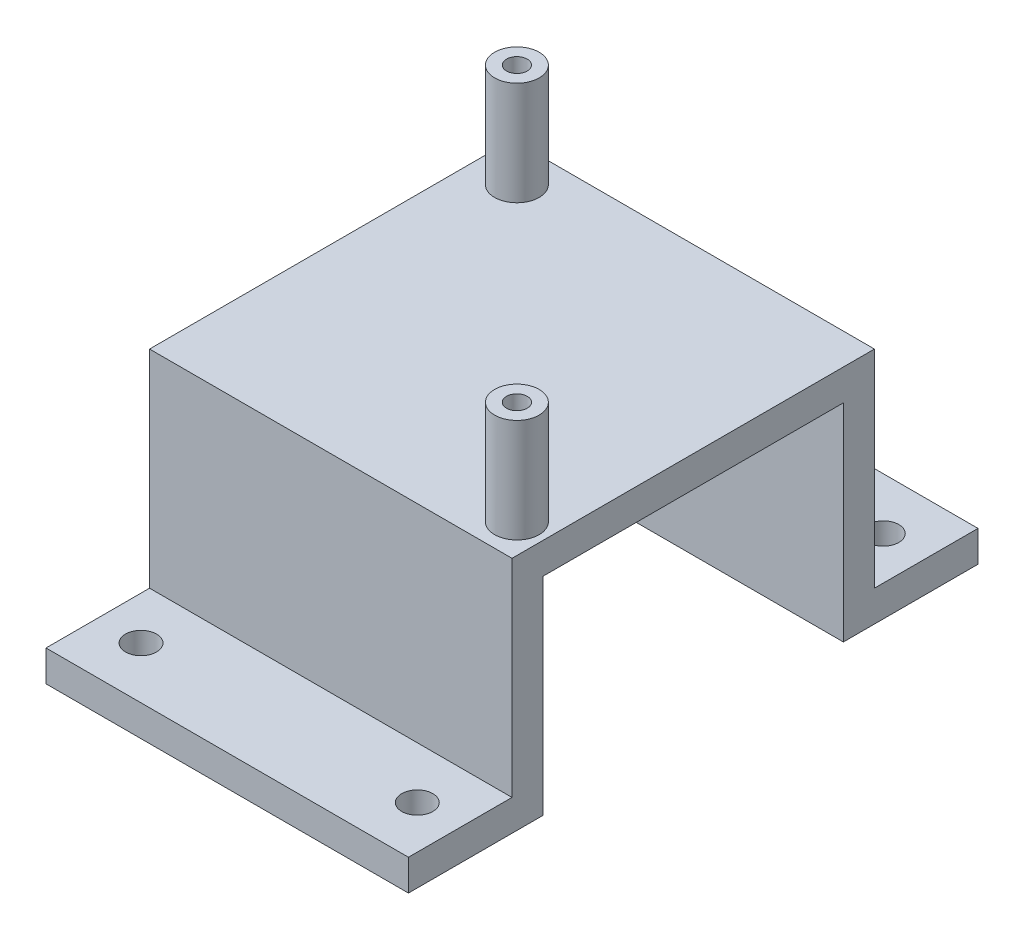
ISO-10303-21;
HEADER;
FILE_DESCRIPTION(('STEP AP214'),'2;1');
FILE_NAME('part.step','',(''),(''),'','','');
FILE_SCHEMA(('AUTOMOTIVE_DESIGN { 1 0 10303 214 1 1 1 1 }'));
ENDSEC;
DATA;
#1=APPLICATION_CONTEXT('core data for automotive mechanical design processes');
#2=APPLICATION_PROTOCOL_DEFINITION('international standard','automotive_design',2000,#1);
#3=PRODUCT_CONTEXT('',#1,'mechanical');
#4=PRODUCT('Part','Part','',(#3));
#5=PRODUCT_RELATED_PRODUCT_CATEGORY('part','',(#4));
#6=PRODUCT_DEFINITION_FORMATION('','',#4);
#7=PRODUCT_DEFINITION_CONTEXT('part definition',#1,'design');
#8=PRODUCT_DEFINITION('design','',#6,#7);
#9=PRODUCT_DEFINITION_SHAPE('','',#8);
#10=(LENGTH_UNIT() NAMED_UNIT(*) SI_UNIT(.MILLI.,.METRE.));
#11=(NAMED_UNIT(*) PLANE_ANGLE_UNIT() SI_UNIT($,.RADIAN.));
#12=(NAMED_UNIT(*) SI_UNIT($,.STERADIAN.) SOLID_ANGLE_UNIT());
#13=UNCERTAINTY_MEASURE_WITH_UNIT(LENGTH_MEASURE(1.E-05),#10,'distance_accuracy_value','');
#14=(GEOMETRIC_REPRESENTATION_CONTEXT(3) GLOBAL_UNCERTAINTY_ASSIGNED_CONTEXT((#13)) GLOBAL_UNIT_ASSIGNED_CONTEXT((#10,
#11,#12)) REPRESENTATION_CONTEXT('',''));
#15=CARTESIAN_POINT('',(0.,0.,0.));
#16=DIRECTION('',(0.,0.,1.));
#17=DIRECTION('',(1.,0.,0.));
#18=AXIS2_PLACEMENT_3D('',#15,#16,#17);
#19=CARTESIAN_POINT('',(-17.5,3.,-17.5));
#20=DIRECTION('',(0.,0.,1.));
#21=DIRECTION('',(1.,0.,0.));
#22=AXIS2_PLACEMENT_3D('',#19,#20,#21);
#23=PLANE('',#22);
#24=DIRECTION('',(1.,0.,0.));
#25=VECTOR('',#24,1.);
#26=CARTESIAN_POINT('',(-17.5,-17.,-17.5));
#27=LINE('',#26,#25);
#28=CARTESIAN_POINT('',(-17.5,-17.,-17.5));
#29=VERTEX_POINT('',#28);
#30=CARTESIAN_POINT('',(17.5,-17.,-17.5));
#31=VERTEX_POINT('',#30);
#32=EDGE_CURVE('E67',#29,#31,#27,.T.);
#33=ORIENTED_EDGE('',*,*,#32,.F.);
#34=DIRECTION('',(0.,-1.,0.));
#35=VECTOR('',#34,1.);
#36=CARTESIAN_POINT('',(-17.5,3.,-17.5));
#37=LINE('',#36,#35);
#38=CARTESIAN_POINT('',(-17.5,3.,-17.5));
#39=VERTEX_POINT('',#38);
#40=EDGE_CURVE('E305',#39,#29,#37,.T.);
#41=ORIENTED_EDGE('',*,*,#40,.F.);
#42=DIRECTION('',(-1.,0.,0.));
#43=VECTOR('',#42,1.);
#44=CARTESIAN_POINT('',(-17.5,3.,-17.5));
#45=LINE('',#44,#43);
#46=CARTESIAN_POINT('',(17.5,3.,-17.5));
#47=VERTEX_POINT('',#46);
#48=EDGE_CURVE('E282',#47,#39,#45,.T.);
#49=ORIENTED_EDGE('',*,*,#48,.F.);
#50=DIRECTION('',(0.,-1.,0.));
#51=VECTOR('',#50,1.);
#52=CARTESIAN_POINT('',(17.5,3.,-17.5));
#53=LINE('',#52,#51);
#54=EDGE_CURVE('E308',#47,#31,#53,.T.);
#55=ORIENTED_EDGE('',*,*,#54,.T.);
#56=EDGE_LOOP('',(#33,#41,#49,#55));
#57=FACE_BOUND('',#56,.T.);
#58=ADVANCED_FACE('F43',(#57),#23,.F.);
#59=CARTESIAN_POINT('',(0.,0.,0.));
#60=DIRECTION('',(0.,-1.,0.));
#61=DIRECTION('',(0.,0.,-1.));
#62=AXIS2_PLACEMENT_3D('',#59,#60,#61);
#63=PLANE('',#62);
#64=DIRECTION('',(0.,0.,1.));
#65=VECTOR('',#64,1.);
#66=CARTESIAN_POINT('',(-17.5,0.,17.5));
#67=LINE('',#66,#65);
#68=CARTESIAN_POINT('',(-17.5,0.,-14.5));
#69=VERTEX_POINT('',#68);
#70=CARTESIAN_POINT('',(-17.5,0.,14.5));
#71=VERTEX_POINT('',#70);
#72=EDGE_CURVE('E283',#69,#71,#67,.T.);
#73=ORIENTED_EDGE('',*,*,#72,.F.);
#74=DIRECTION('',(-1.,0.,0.));
#75=VECTOR('',#74,1.);
#76=CARTESIAN_POINT('',(17.5,0.,-14.5));
#77=LINE('',#76,#75);
#78=CARTESIAN_POINT('',(17.5,0.,-14.5));
#79=VERTEX_POINT('',#78);
#80=EDGE_CURVE('E228',#79,#69,#77,.T.);
#81=ORIENTED_EDGE('',*,*,#80,.F.);
#82=DIRECTION('',(0.,0.,-1.));
#83=VECTOR('',#82,1.);
#84=CARTESIAN_POINT('',(17.5,0.,17.5));
#85=LINE('',#84,#83);
#86=CARTESIAN_POINT('',(17.5,0.,14.5));
#87=VERTEX_POINT('',#86);
#88=EDGE_CURVE('E277',#87,#79,#85,.T.);
#89=ORIENTED_EDGE('',*,*,#88,.F.);
#90=DIRECTION('',(1.,0.,0.));
#91=VECTOR('',#90,1.);
#92=CARTESIAN_POINT('',(-17.5,0.,14.5));
#93=LINE('',#92,#91);
#94=EDGE_CURVE('E147',#71,#87,#93,.T.);
#95=ORIENTED_EDGE('',*,*,#94,.F.);
#96=EDGE_LOOP('',(#73,#81,#89,#95));
#97=FACE_BOUND('',#96,.T.);
#98=ADVANCED_FACE('F357',(#97),#63,.T.);
#99=CARTESIAN_POINT('',(17.5,3.,17.5));
#100=DIRECTION('',(-1.,0.,0.));
#101=DIRECTION('',(0.,0.,1.));
#102=AXIS2_PLACEMENT_3D('',#99,#100,#101);
#103=PLANE('',#102);
#104=DIRECTION('',(0.,-1.,0.));
#105=VECTOR('',#104,1.);
#106=CARTESIAN_POINT('',(17.5,3.,17.5));
#107=LINE('',#106,#105);
#108=CARTESIAN_POINT('',(17.5,3.,17.5));
#109=VERTEX_POINT('',#108);
#110=CARTESIAN_POINT('',(17.5,-17.,17.5));
#111=VERTEX_POINT('',#110);
#112=EDGE_CURVE('E292',#109,#111,#107,.T.);
#113=ORIENTED_EDGE('',*,*,#112,.T.);
#114=DIRECTION('',(0.,0.,-1.));
#115=VECTOR('',#114,1.);
#116=CARTESIAN_POINT('',(17.5,-17.,27.5));
#117=LINE('',#116,#115);
#118=CARTESIAN_POINT('',(17.5,-17.,27.5));
#119=VERTEX_POINT('',#118);
#120=EDGE_CURVE('E59',#119,#111,#117,.T.);
#121=ORIENTED_EDGE('',*,*,#120,.F.);
#122=DIRECTION('',(0.,-1.,0.));
#123=VECTOR('',#122,1.);
#124=CARTESIAN_POINT('',(17.5,-20.,27.5));
#125=LINE('',#124,#123);
#126=CARTESIAN_POINT('',(17.5,-20.,27.5));
#127=VERTEX_POINT('',#126);
#128=EDGE_CURVE('E163',#119,#127,#125,.T.);
#129=ORIENTED_EDGE('',*,*,#128,.T.);
#130=DIRECTION('',(0.,0.,1.));
#131=VECTOR('',#130,1.);
#132=CARTESIAN_POINT('',(17.5,-20.,17.5));
#133=LINE('',#132,#131);
#134=CARTESIAN_POINT('',(17.5,-20.,14.5));
#135=VERTEX_POINT('',#134);
#136=EDGE_CURVE('E161',#135,#127,#133,.T.);
#137=ORIENTED_EDGE('',*,*,#136,.F.);
#138=DIRECTION('',(0.,1.,0.));
#139=VECTOR('',#138,1.);
#140=CARTESIAN_POINT('',(17.5,-20.,14.5));
#141=LINE('',#140,#139);
#142=EDGE_CURVE('E244',#135,#87,#141,.T.);
#143=ORIENTED_EDGE('',*,*,#142,.T.);
#144=ORIENTED_EDGE('',*,*,#88,.T.);
#145=DIRECTION('',(0.,1.,0.));
#146=VECTOR('',#145,1.);
#147=CARTESIAN_POINT('',(17.5,-20.,-14.5));
#148=LINE('',#147,#146);
#149=CARTESIAN_POINT('',(17.5,-20.,-14.5));
#150=VERTEX_POINT('',#149);
#151=EDGE_CURVE('E220',#150,#79,#148,.T.);
#152=ORIENTED_EDGE('',*,*,#151,.F.);
#153=DIRECTION('',(0.,0.,1.));
#154=VECTOR('',#153,1.);
#155=CARTESIAN_POINT('',(17.5,-20.,-17.5));
#156=LINE('',#155,#154);
#157=CARTESIAN_POINT('',(17.5,-20.,-27.5));
#158=VERTEX_POINT('',#157);
#159=EDGE_CURVE('E231',#158,#150,#156,.T.);
#160=ORIENTED_EDGE('',*,*,#159,.F.);
#161=DIRECTION('',(0.,-1.,0.));
#162=VECTOR('',#161,1.);
#163=CARTESIAN_POINT('',(17.5,-20.,-27.5));
#164=LINE('',#163,#162);
#165=CARTESIAN_POINT('',(17.5,-17.,-27.5));
#166=VERTEX_POINT('',#165);
#167=EDGE_CURVE('E202',#166,#158,#164,.T.);
#168=ORIENTED_EDGE('',*,*,#167,.F.);
#169=DIRECTION('',(0.,0.,1.));
#170=VECTOR('',#169,1.);
#171=CARTESIAN_POINT('',(17.5,-17.,-27.5));
#172=LINE('',#171,#170);
#173=EDGE_CURVE('E210',#166,#31,#172,.T.);
#174=ORIENTED_EDGE('',*,*,#173,.T.);
#175=ORIENTED_EDGE('',*,*,#54,.F.);
#176=DIRECTION('',(0.,0.,-1.));
#177=VECTOR('',#176,1.);
#178=CARTESIAN_POINT('',(17.5,3.,17.5));
#179=LINE('',#178,#177);
#180=EDGE_CURVE('E278',#109,#47,#179,.T.);
#181=ORIENTED_EDGE('',*,*,#180,.F.);
#182=EDGE_LOOP('',(#113,#121,#129,#137,#143,#144,#152,#160,#168,#174,#175,#181));
#183=FACE_BOUND('',#182,.T.);
#184=ADVANCED_FACE('F45',(#183),#103,.F.);
#185=CARTESIAN_POINT('',(-17.5,3.,17.5));
#186=DIRECTION('',(1.,0.,0.));
#187=DIRECTION('',(0.,0.,-1.));
#188=AXIS2_PLACEMENT_3D('',#185,#186,#187);
#189=PLANE('',#188);
#190=ORIENTED_EDGE('',*,*,#40,.T.);
#191=DIRECTION('',(0.,0.,1.));
#192=VECTOR('',#191,1.);
#193=CARTESIAN_POINT('',(-17.5,-17.,-27.5));
#194=LINE('',#193,#192);
#195=CARTESIAN_POINT('',(-17.5,-17.,-27.5));
#196=VERTEX_POINT('',#195);
#197=EDGE_CURVE('E216',#196,#29,#194,.T.);
#198=ORIENTED_EDGE('',*,*,#197,.F.);
#199=DIRECTION('',(0.,1.,0.));
#200=VECTOR('',#199,1.);
#201=CARTESIAN_POINT('',(-17.5,-20.,-27.5));
#202=LINE('',#201,#200);
#203=CARTESIAN_POINT('',(-17.5,-20.,-27.5));
#204=VERTEX_POINT('',#203);
#205=EDGE_CURVE('E195',#204,#196,#202,.T.);
#206=ORIENTED_EDGE('',*,*,#205,.F.);
#207=DIRECTION('',(0.,0.,-1.));
#208=VECTOR('',#207,1.);
#209=CARTESIAN_POINT('',(-17.5,-20.,-17.5));
#210=LINE('',#209,#208);
#211=CARTESIAN_POINT('',(-17.5,-20.,-14.5));
#212=VERTEX_POINT('',#211);
#213=EDGE_CURVE('E227',#212,#204,#210,.T.);
#214=ORIENTED_EDGE('',*,*,#213,.F.);
#215=DIRECTION('',(0.,1.,0.));
#216=VECTOR('',#215,1.);
#217=CARTESIAN_POINT('',(-17.5,-20.,-14.5));
#218=LINE('',#217,#216);
#219=EDGE_CURVE('E223',#212,#69,#218,.T.);
#220=ORIENTED_EDGE('',*,*,#219,.T.);
#221=ORIENTED_EDGE('',*,*,#72,.T.);
#222=DIRECTION('',(0.,1.,0.));
#223=VECTOR('',#222,1.);
#224=CARTESIAN_POINT('',(-17.5,-20.,14.5));
#225=LINE('',#224,#223);
#226=CARTESIAN_POINT('',(-17.5,-20.,14.5));
#227=VERTEX_POINT('',#226);
#228=EDGE_CURVE('E142',#227,#71,#225,.T.);
#229=ORIENTED_EDGE('',*,*,#228,.F.);
#230=DIRECTION('',(0.,0.,-1.));
#231=VECTOR('',#230,1.);
#232=CARTESIAN_POINT('',(-17.5,-20.,17.5));
#233=LINE('',#232,#231);
#234=CARTESIAN_POINT('',(-17.5,-20.,27.5));
#235=VERTEX_POINT('',#234);
#236=EDGE_CURVE('E136',#235,#227,#233,.T.);
#237=ORIENTED_EDGE('',*,*,#236,.F.);
#238=DIRECTION('',(0.,1.,0.));
#239=VECTOR('',#238,1.);
#240=CARTESIAN_POINT('',(-17.5,-20.,27.5));
#241=LINE('',#240,#239);
#242=CARTESIAN_POINT('',(-17.5,-17.,27.5));
#243=VERTEX_POINT('',#242);
#244=EDGE_CURVE('E139',#235,#243,#241,.T.);
#245=ORIENTED_EDGE('',*,*,#244,.T.);
#246=DIRECTION('',(0.,0.,-1.));
#247=VECTOR('',#246,1.);
#248=CARTESIAN_POINT('',(-17.5,-17.,27.5));
#249=LINE('',#248,#247);
#250=CARTESIAN_POINT('',(-17.5,-17.,17.5));
#251=VERTEX_POINT('',#250);
#252=EDGE_CURVE('E171',#243,#251,#249,.T.);
#253=ORIENTED_EDGE('',*,*,#252,.T.);
#254=DIRECTION('',(0.,-1.,0.));
#255=VECTOR('',#254,1.);
#256=CARTESIAN_POINT('',(-17.5,3.,17.5));
#257=LINE('',#256,#255);
#258=CARTESIAN_POINT('',(-17.5,3.,17.5));
#259=VERTEX_POINT('',#258);
#260=EDGE_CURVE('E301',#259,#251,#257,.T.);
#261=ORIENTED_EDGE('',*,*,#260,.F.);
#262=DIRECTION('',(0.,0.,1.));
#263=VECTOR('',#262,1.);
#264=CARTESIAN_POINT('',(-17.5,3.,17.5));
#265=LINE('',#264,#263);
#266=EDGE_CURVE('E286',#39,#259,#265,.T.);
#267=ORIENTED_EDGE('',*,*,#266,.F.);
#268=EDGE_LOOP('',(#190,#198,#206,#214,#220,#221,#229,#237,#245,#253,#261,#267));
#269=FACE_BOUND('',#268,.T.);
#270=ADVANCED_FACE('F138',(#269),#189,.F.);
#271=CARTESIAN_POINT('',(-17.5,3.,17.5));
#272=DIRECTION('',(0.,0.,-1.));
#273=DIRECTION('',(-1.,0.,0.));
#274=AXIS2_PLACEMENT_3D('',#271,#272,#273);
#275=PLANE('',#274);
#276=ORIENTED_EDGE('',*,*,#260,.T.);
#277=DIRECTION('',(1.,0.,0.));
#278=VECTOR('',#277,1.);
#279=CARTESIAN_POINT('',(-17.5,-17.,17.5));
#280=LINE('',#279,#278);
#281=EDGE_CURVE('E157',#251,#111,#280,.T.);
#282=ORIENTED_EDGE('',*,*,#281,.T.);
#283=ORIENTED_EDGE('',*,*,#112,.F.);
#284=DIRECTION('',(1.,0.,0.));
#285=VECTOR('',#284,1.);
#286=CARTESIAN_POINT('',(-17.5,3.,17.5));
#287=LINE('',#286,#285);
#288=EDGE_CURVE('E289',#259,#109,#287,.T.);
#289=ORIENTED_EDGE('',*,*,#288,.F.);
#290=EDGE_LOOP('',(#276,#282,#283,#289));
#291=FACE_BOUND('',#290,.T.);
#292=ADVANCED_FACE('F320',(#291),#275,.F.);
#293=CARTESIAN_POINT('',(0.,3.,0.));
#294=DIRECTION('',(0.,-1.,0.));
#295=DIRECTION('',(0.,0.,-1.));
#296=AXIS2_PLACEMENT_3D('',#293,#294,#295);
#297=PLANE('',#296);
#298=CARTESIAN_POINT('',(14.6873098288263,3.,14.2151940368629));
#299=DIRECTION('',(0.,-1.,0.));
#300=DIRECTION('',(0.,0.,-1.));
#301=AXIS2_PLACEMENT_3D('',#298,#299,#300);
#302=CIRCLE('',#301,2.15);
#303=CARTESIAN_POINT('',(14.6873098288263,3.,12.0651940368629));
#304=VERTEX_POINT('',#303);
#305=EDGE_CURVE('E11',#304,#304,#302,.F.);
#306=ORIENTED_EDGE('',*,*,#305,.F.);
#307=EDGE_LOOP('',(#306));
#308=FACE_BOUND('',#307,.T.);
#309=CARTESIAN_POINT('',(-13.5126901711737,3.,-13.9848059631371));
#310=DIRECTION('',(0.,-1.,0.));
#311=DIRECTION('',(0.,0.,-1.));
#312=AXIS2_PLACEMENT_3D('',#309,#310,#311);
#313=CIRCLE('',#312,2.15);
#314=CARTESIAN_POINT('',(-13.5126901711737,3.,-16.1348059631371));
#315=VERTEX_POINT('',#314);
#316=EDGE_CURVE('E52',#315,#315,#313,.F.);
#317=ORIENTED_EDGE('',*,*,#316,.F.);
#318=EDGE_LOOP('',(#317));
#319=FACE_BOUND('',#318,.T.);
#320=ORIENTED_EDGE('',*,*,#180,.T.);
#321=ORIENTED_EDGE('',*,*,#48,.T.);
#322=ORIENTED_EDGE('',*,*,#266,.T.);
#323=ORIENTED_EDGE('',*,*,#288,.T.);
#324=EDGE_LOOP('',(#320,#321,#322,#323));
#325=FACE_BOUND('',#324,.T.);
#326=ADVANCED_FACE('F316',(#308,#319,#325),#297,.F.);
#327=CARTESIAN_POINT('',(-13.5126901711737,13.,-13.9848059631371));
#328=DIRECTION('',(0.,1.,0.));
#329=DIRECTION('',(0.,0.,1.));
#330=AXIS2_PLACEMENT_3D('',#327,#328,#329);
#331=PLANE('',#330);
#332=CARTESIAN_POINT('',(-13.5126901711737,13.,-13.9848059631371));
#333=DIRECTION('',(0.,1.,0.));
#334=DIRECTION('',(0.,0.,1.));
#335=AXIS2_PLACEMENT_3D('',#332,#333,#334);
#336=CIRCLE('',#335,2.15);
#337=CARTESIAN_POINT('',(-13.5126901711737,13.,-11.8348059631371));
#338=VERTEX_POINT('',#337);
#339=EDGE_CURVE('E270',#338,#338,#336,.T.);
#340=ORIENTED_EDGE('',*,*,#339,.T.);
#341=EDGE_LOOP('',(#340));
#342=FACE_BOUND('',#341,.T.);
#343=CARTESIAN_POINT('',(-13.5126901711737,13.,-13.9848059631371));
#344=DIRECTION('',(0.,1.,0.));
#345=DIRECTION('',(0.,0.,1.));
#346=AXIS2_PLACEMENT_3D('',#343,#344,#345);
#347=CIRCLE('',#346,1.);
#348=CARTESIAN_POINT('',(-13.5126901711737,13.,-12.9848059631371));
#349=VERTEX_POINT('',#348);
#350=EDGE_CURVE('E266',#349,#349,#347,.T.);
#351=ORIENTED_EDGE('',*,*,#350,.F.);
#352=EDGE_LOOP('',(#351));
#353=FACE_BOUND('',#352,.T.);
#354=ADVANCED_FACE('F319',(#342,#353),#331,.T.);
#355=CARTESIAN_POINT('',(-13.5126901711737,13.,-13.9848059631371));
#356=DIRECTION('',(0.,-1.,0.));
#357=DIRECTION('',(0.,0.,-1.));
#358=AXIS2_PLACEMENT_3D('',#355,#356,#357);
#359=CYLINDRICAL_SURFACE('',#358,2.15);
#360=ORIENTED_EDGE('',*,*,#339,.F.);
#361=EDGE_LOOP('',(#360));
#362=FACE_BOUND('',#361,.T.);
#363=ORIENTED_EDGE('',*,*,#316,.T.);
#364=EDGE_LOOP('',(#363));
#365=FACE_BOUND('',#364,.T.);
#366=ADVANCED_FACE('F314',(#362,#365),#359,.T.);
#367=CARTESIAN_POINT('',(-13.5126901711737,13.,-13.9848059631371));
#368=DIRECTION('',(0.,-1.,0.));
#369=DIRECTION('',(0.,0.,-1.));
#370=AXIS2_PLACEMENT_3D('',#367,#368,#369);
#371=CYLINDRICAL_SURFACE('',#370,1.);
#372=ORIENTED_EDGE('',*,*,#350,.T.);
#373=EDGE_LOOP('',(#372));
#374=FACE_BOUND('',#373,.T.);
#375=CARTESIAN_POINT('',(-13.5126901711737,3.,-13.9848059631371));
#376=DIRECTION('',(0.,1.,0.));
#377=DIRECTION('',(0.,0.,1.));
#378=AXIS2_PLACEMENT_3D('',#375,#376,#377);
#379=CIRCLE('',#378,1.);
#380=CARTESIAN_POINT('',(-13.5126901711737,3.,-12.9848059631371));
#381=VERTEX_POINT('',#380);
#382=EDGE_CURVE('E262',#381,#381,#379,.T.);
#383=ORIENTED_EDGE('',*,*,#382,.F.);
#384=EDGE_LOOP('',(#383));
#385=FACE_BOUND('',#384,.T.);
#386=ADVANCED_FACE('F372',(#374,#385),#371,.F.);
#387=ORIENTED_EDGE('',*,*,#382,.T.);
#388=EDGE_LOOP('',(#387));
#389=FACE_BOUND('',#388,.T.);
#390=ADVANCED_FACE('F324',(#389),#297,.F.);
#391=CARTESIAN_POINT('',(14.6873098288263,13.,14.2151940368629));
#392=DIRECTION('',(0.,1.,0.));
#393=DIRECTION('',(0.,0.,1.));
#394=AXIS2_PLACEMENT_3D('',#391,#392,#393);
#395=PLANE('',#394);
#396=CARTESIAN_POINT('',(14.6873098288263,13.,14.2151940368629));
#397=DIRECTION('',(0.,1.,0.));
#398=DIRECTION('',(0.,0.,1.));
#399=AXIS2_PLACEMENT_3D('',#396,#397,#398);
#400=CIRCLE('',#399,2.15);
#401=CARTESIAN_POINT('',(14.6873098288263,13.,16.3651940368629));
#402=VERTEX_POINT('',#401);
#403=EDGE_CURVE('E253',#402,#402,#400,.T.);
#404=ORIENTED_EDGE('',*,*,#403,.T.);
#405=EDGE_LOOP('',(#404));
#406=FACE_BOUND('',#405,.T.);
#407=CARTESIAN_POINT('',(14.6873098288263,13.,14.2151940368629));
#408=DIRECTION('',(0.,1.,0.));
#409=DIRECTION('',(0.,0.,1.));
#410=AXIS2_PLACEMENT_3D('',#407,#408,#409);
#411=CIRCLE('',#410,1.);
#412=CARTESIAN_POINT('',(14.6873098288263,13.,15.2151940368629));
#413=VERTEX_POINT('',#412);
#414=EDGE_CURVE('E257',#413,#413,#411,.T.);
#415=ORIENTED_EDGE('',*,*,#414,.F.);
#416=EDGE_LOOP('',(#415));
#417=FACE_BOUND('',#416,.T.);
#418=ADVANCED_FACE('F385',(#406,#417),#395,.T.);
#419=CARTESIAN_POINT('',(14.6873098288263,13.,14.2151940368629));
#420=DIRECTION('',(0.,-1.,0.));
#421=DIRECTION('',(0.,0.,-1.));
#422=AXIS2_PLACEMENT_3D('',#419,#420,#421);
#423=CYLINDRICAL_SURFACE('',#422,2.15);
#424=ORIENTED_EDGE('',*,*,#403,.F.);
#425=EDGE_LOOP('',(#424));
#426=FACE_BOUND('',#425,.T.);
#427=ORIENTED_EDGE('',*,*,#305,.T.);
#428=EDGE_LOOP('',(#427));
#429=FACE_BOUND('',#428,.T.);
#430=ADVANCED_FACE('F383',(#426,#429),#423,.T.);
#431=CARTESIAN_POINT('',(14.6873098288263,13.,14.2151940368629));
#432=DIRECTION('',(0.,-1.,0.));
#433=DIRECTION('',(0.,0.,-1.));
#434=AXIS2_PLACEMENT_3D('',#431,#432,#433);
#435=CYLINDRICAL_SURFACE('',#434,1.);
#436=ORIENTED_EDGE('',*,*,#414,.T.);
#437=EDGE_LOOP('',(#436));
#438=FACE_BOUND('',#437,.T.);
#439=CARTESIAN_POINT('',(14.6873098288263,3.,14.2151940368629));
#440=DIRECTION('',(0.,1.,0.));
#441=DIRECTION('',(0.,0.,1.));
#442=AXIS2_PLACEMENT_3D('',#439,#440,#441);
#443=CIRCLE('',#442,1.);
#444=CARTESIAN_POINT('',(14.6873098288263,3.,15.2151940368629));
#445=VERTEX_POINT('',#444);
#446=EDGE_CURVE('E258',#445,#445,#443,.T.);
#447=ORIENTED_EDGE('',*,*,#446,.F.);
#448=EDGE_LOOP('',(#447));
#449=FACE_BOUND('',#448,.T.);
#450=ADVANCED_FACE('F380',(#438,#449),#435,.F.);
#451=ORIENTED_EDGE('',*,*,#446,.T.);
#452=EDGE_LOOP('',(#451));
#453=FACE_BOUND('',#452,.T.);
#454=ADVANCED_FACE('F323',(#453),#297,.F.);
#455=CARTESIAN_POINT('',(-17.5,-20.,14.5));
#456=DIRECTION('',(0.,0.,1.));
#457=DIRECTION('',(1.,0.,0.));
#458=AXIS2_PLACEMENT_3D('',#455,#456,#457);
#459=PLANE('',#458);
#460=ORIENTED_EDGE('',*,*,#94,.T.);
#461=ORIENTED_EDGE('',*,*,#142,.F.);
#462=DIRECTION('',(1.,0.,0.));
#463=VECTOR('',#462,1.);
#464=CARTESIAN_POINT('',(-17.5,-20.,14.5));
#465=LINE('',#464,#463);
#466=EDGE_CURVE('E146',#227,#135,#465,.T.);
#467=ORIENTED_EDGE('',*,*,#466,.F.);
#468=ORIENTED_EDGE('',*,*,#228,.T.);
#469=EDGE_LOOP('',(#460,#461,#467,#468));
#470=FACE_BOUND('',#469,.T.);
#471=ADVANCED_FACE('F392',(#470),#459,.F.);
#472=CARTESIAN_POINT('',(0.,-20.,0.));
#473=DIRECTION('',(0.,-1.,0.));
#474=DIRECTION('',(0.,0.,-1.));
#475=AXIS2_PLACEMENT_3D('',#472,#473,#474);
#476=PLANE('',#475);
#477=CARTESIAN_POINT('',(-13.3246215865193,-20.,22.5));
#478=DIRECTION('',(0.,-1.,0.));
#479=DIRECTION('',(0.,0.,-1.));
#480=AXIS2_PLACEMENT_3D('',#477,#478,#479);
#481=CIRCLE('',#480,1.5);
#482=CARTESIAN_POINT('',(-13.3246215865193,-20.,21.));
#483=VERTEX_POINT('',#482);
#484=EDGE_CURVE('E174',#483,#483,#481,.F.);
#485=ORIENTED_EDGE('',*,*,#484,.T.);
#486=EDGE_LOOP('',(#485));
#487=FACE_BOUND('',#486,.T.);
#488=CARTESIAN_POINT('',(13.3552529005113,-20.,22.5));
#489=DIRECTION('',(0.,-1.,0.));
#490=DIRECTION('',(0.,0.,-1.));
#491=AXIS2_PLACEMENT_3D('',#488,#489,#490);
#492=CIRCLE('',#491,1.5);
#493=CARTESIAN_POINT('',(13.3552529005113,-20.,21.));
#494=VERTEX_POINT('',#493);
#495=EDGE_CURVE('E689',#494,#494,#492,.F.);
#496=ORIENTED_EDGE('',*,*,#495,.T.);
#497=EDGE_LOOP('',(#496));
#498=FACE_BOUND('',#497,.T.);
#499=ORIENTED_EDGE('',*,*,#236,.T.);
#500=ORIENTED_EDGE('',*,*,#466,.T.);
#501=ORIENTED_EDGE('',*,*,#136,.T.);
#502=DIRECTION('',(-1.,0.,0.));
#503=VECTOR('',#502,1.);
#504=CARTESIAN_POINT('',(-17.5,-20.,27.5));
#505=LINE('',#504,#503);
#506=EDGE_CURVE('E153',#127,#235,#505,.T.);
#507=ORIENTED_EDGE('',*,*,#506,.T.);
#508=EDGE_LOOP('',(#499,#500,#501,#507));
#509=FACE_BOUND('',#508,.T.);
#510=ADVANCED_FACE('F159',(#487,#498,#509),#476,.T.);
#511=CARTESIAN_POINT('',(17.5,-20.,-14.5));
#512=DIRECTION('',(0.,0.,-1.));
#513=DIRECTION('',(-1.,0.,0.));
#514=AXIS2_PLACEMENT_3D('',#511,#512,#513);
#515=PLANE('',#514);
#516=ORIENTED_EDGE('',*,*,#80,.T.);
#517=ORIENTED_EDGE('',*,*,#219,.F.);
#518=DIRECTION('',(-1.,0.,0.));
#519=VECTOR('',#518,1.);
#520=CARTESIAN_POINT('',(17.5,-20.,-14.5));
#521=LINE('',#520,#519);
#522=EDGE_CURVE('E234',#150,#212,#521,.T.);
#523=ORIENTED_EDGE('',*,*,#522,.F.);
#524=ORIENTED_EDGE('',*,*,#151,.T.);
#525=EDGE_LOOP('',(#516,#517,#523,#524));
#526=FACE_BOUND('',#525,.T.);
#527=ADVANCED_FACE('F398',(#526),#515,.F.);
#528=CARTESIAN_POINT('',(0.,-20.,0.));
#529=DIRECTION('',(0.,-1.,0.));
#530=DIRECTION('',(0.,0.,-1.));
#531=AXIS2_PLACEMENT_3D('',#528,#529,#530);
#532=PLANE('',#531);
#533=CARTESIAN_POINT('',(-13.3246215865193,-20.,-22.5));
#534=DIRECTION('',(0.,-1.,0.));
#535=DIRECTION('',(0.,0.,-1.));
#536=AXIS2_PLACEMENT_3D('',#533,#534,#535);
#537=CIRCLE('',#536,1.5);
#538=CARTESIAN_POINT('',(-13.3246215865193,-20.,-24.));
#539=VERTEX_POINT('',#538);
#540=EDGE_CURVE('E191',#539,#539,#537,.T.);
#541=ORIENTED_EDGE('',*,*,#540,.F.);
#542=EDGE_LOOP('',(#541));
#543=FACE_BOUND('',#542,.T.);
#544=CARTESIAN_POINT('',(13.3552529005113,-20.,-22.5));
#545=DIRECTION('',(0.,-1.,0.));
#546=DIRECTION('',(0.,0.,-1.));
#547=AXIS2_PLACEMENT_3D('',#544,#545,#546);
#548=CIRCLE('',#547,1.5);
#549=CARTESIAN_POINT('',(13.3552529005113,-20.,-24.));
#550=VERTEX_POINT('',#549);
#551=EDGE_CURVE('E184',#550,#550,#548,.T.);
#552=ORIENTED_EDGE('',*,*,#551,.F.);
#553=EDGE_LOOP('',(#552));
#554=FACE_BOUND('',#553,.T.);
#555=ORIENTED_EDGE('',*,*,#159,.T.);
#556=ORIENTED_EDGE('',*,*,#522,.T.);
#557=ORIENTED_EDGE('',*,*,#213,.T.);
#558=DIRECTION('',(-1.,0.,0.));
#559=VECTOR('',#558,1.);
#560=CARTESIAN_POINT('',(-17.5,-20.,-27.5));
#561=LINE('',#560,#559);
#562=EDGE_CURVE('E206',#158,#204,#561,.T.);
#563=ORIENTED_EDGE('',*,*,#562,.F.);
#564=EDGE_LOOP('',(#555,#556,#557,#563));
#565=FACE_BOUND('',#564,.T.);
#566=ADVANCED_FACE('F400',(#543,#554,#565),#532,.T.);
#567=CARTESIAN_POINT('',(-17.5,-17.,-27.5));
#568=DIRECTION('',(0.,-1.,0.));
#569=DIRECTION('',(0.,0.,-1.));
#570=AXIS2_PLACEMENT_3D('',#567,#568,#569);
#571=PLANE('',#570);
#572=CARTESIAN_POINT('',(-13.3246215865193,-17.,-22.5));
#573=DIRECTION('',(0.,1.,0.));
#574=DIRECTION('',(-1.,0.,0.));
#575=AXIS2_PLACEMENT_3D('',#572,#573,#574);
#576=CIRCLE('',#575,1.5);
#577=CARTESIAN_POINT('',(-14.8246215865193,-17.,-22.5));
#578=VERTEX_POINT('',#577);
#579=EDGE_CURVE('E180',#578,#578,#576,.T.);
#580=ORIENTED_EDGE('',*,*,#579,.F.);
#581=EDGE_LOOP('',(#580));
#582=FACE_BOUND('',#581,.T.);
#583=CARTESIAN_POINT('',(13.3552529005113,-17.,-22.5));
#584=DIRECTION('',(0.,1.,0.));
#585=DIRECTION('',(-1.,0.,0.));
#586=AXIS2_PLACEMENT_3D('',#583,#584,#585);
#587=CIRCLE('',#586,1.5);
#588=CARTESIAN_POINT('',(11.8552529005113,-17.,-22.5));
#589=VERTEX_POINT('',#588);
#590=EDGE_CURVE('E179',#589,#589,#587,.T.);
#591=ORIENTED_EDGE('',*,*,#590,.F.);
#592=EDGE_LOOP('',(#591));
#593=FACE_BOUND('',#592,.T.);
#594=ORIENTED_EDGE('',*,*,#32,.T.);
#595=ORIENTED_EDGE('',*,*,#173,.F.);
#596=DIRECTION('',(1.,0.,0.));
#597=VECTOR('',#596,1.);
#598=CARTESIAN_POINT('',(-17.5,-17.,-27.5));
#599=LINE('',#598,#597);
#600=EDGE_CURVE('E199',#196,#166,#599,.T.);
#601=ORIENTED_EDGE('',*,*,#600,.F.);
#602=ORIENTED_EDGE('',*,*,#197,.T.);
#603=EDGE_LOOP('',(#594,#595,#601,#602));
#604=FACE_BOUND('',#603,.T.);
#605=ADVANCED_FACE('F333',(#582,#593,#604),#571,.F.);
#606=CARTESIAN_POINT('',(0.,0.,-27.5));
#607=DIRECTION('',(0.,0.,-1.));
#608=DIRECTION('',(-1.,0.,0.));
#609=AXIS2_PLACEMENT_3D('',#606,#607,#608);
#610=PLANE('',#609);
#611=ORIENTED_EDGE('',*,*,#205,.T.);
#612=ORIENTED_EDGE('',*,*,#600,.T.);
#613=ORIENTED_EDGE('',*,*,#167,.T.);
#614=ORIENTED_EDGE('',*,*,#562,.T.);
#615=EDGE_LOOP('',(#611,#612,#613,#614));
#616=FACE_BOUND('',#615,.T.);
#617=ADVANCED_FACE('F409',(#616),#610,.T.);
#618=CARTESIAN_POINT('',(13.3552529005113,-27.,-22.5));
#619=DIRECTION('',(0.,1.,0.));
#620=DIRECTION('',(-1.,0.,0.));
#621=AXIS2_PLACEMENT_3D('',#618,#619,#620);
#622=CYLINDRICAL_SURFACE('',#621,1.5);
#623=ORIENTED_EDGE('',*,*,#551,.T.);
#624=EDGE_LOOP('',(#623));
#625=FACE_BOUND('',#624,.T.);
#626=ORIENTED_EDGE('',*,*,#590,.T.);
#627=EDGE_LOOP('',(#626));
#628=FACE_BOUND('',#627,.T.);
#629=ADVANCED_FACE('F351',(#625,#628),#622,.F.);
#630=CARTESIAN_POINT('',(-13.3246215865193,-27.,-22.5));
#631=DIRECTION('',(0.,1.,0.));
#632=DIRECTION('',(-1.,0.,0.));
#633=AXIS2_PLACEMENT_3D('',#630,#631,#632);
#634=CYLINDRICAL_SURFACE('',#633,1.5);
#635=ORIENTED_EDGE('',*,*,#540,.T.);
#636=EDGE_LOOP('',(#635));
#637=FACE_BOUND('',#636,.T.);
#638=ORIENTED_EDGE('',*,*,#579,.T.);
#639=EDGE_LOOP('',(#638));
#640=FACE_BOUND('',#639,.T.);
#641=ADVANCED_FACE('F342',(#637,#640),#634,.F.);
#642=CARTESIAN_POINT('',(-17.5,-17.,27.5));
#643=DIRECTION('',(0.,1.,0.));
#644=DIRECTION('',(0.,0.,1.));
#645=AXIS2_PLACEMENT_3D('',#642,#643,#644);
#646=PLANE('',#645);
#647=CARTESIAN_POINT('',(-13.3246215865193,-17.,22.5));
#648=DIRECTION('',(0.,-1.,0.));
#649=DIRECTION('',(-1.,0.,0.));
#650=AXIS2_PLACEMENT_3D('',#647,#648,#649);
#651=CIRCLE('',#650,1.5);
#652=CARTESIAN_POINT('',(-14.8246215865193,-17.,22.5));
#653=VERTEX_POINT('',#652);
#654=EDGE_CURVE('E687',#653,#653,#651,.T.);
#655=ORIENTED_EDGE('',*,*,#654,.T.);
#656=EDGE_LOOP('',(#655));
#657=FACE_BOUND('',#656,.T.);
#658=CARTESIAN_POINT('',(13.3552529005113,-17.,22.5));
#659=DIRECTION('',(0.,-1.,0.));
#660=DIRECTION('',(-1.,0.,0.));
#661=AXIS2_PLACEMENT_3D('',#658,#659,#660);
#662=CIRCLE('',#661,1.5);
#663=CARTESIAN_POINT('',(11.8552529005113,-17.,22.5));
#664=VERTEX_POINT('',#663);
#665=EDGE_CURVE('E690',#664,#664,#662,.T.);
#666=ORIENTED_EDGE('',*,*,#665,.T.);
#667=EDGE_LOOP('',(#666));
#668=FACE_BOUND('',#667,.T.);
#669=ORIENTED_EDGE('',*,*,#281,.F.);
#670=ORIENTED_EDGE('',*,*,#252,.F.);
#671=DIRECTION('',(1.,0.,0.));
#672=VECTOR('',#671,1.);
#673=CARTESIAN_POINT('',(-17.5,-17.,27.5));
#674=LINE('',#673,#672);
#675=EDGE_CURVE('E155',#243,#119,#674,.T.);
#676=ORIENTED_EDGE('',*,*,#675,.T.);
#677=ORIENTED_EDGE('',*,*,#120,.T.);
#678=EDGE_LOOP('',(#669,#670,#676,#677));
#679=FACE_BOUND('',#678,.T.);
#680=ADVANCED_FACE('F340',(#657,#668,#679),#646,.T.);
#681=CARTESIAN_POINT('',(0.,0.,27.5));
#682=DIRECTION('',(0.,0.,1.));
#683=DIRECTION('',(-1.,0.,0.));
#684=AXIS2_PLACEMENT_3D('',#681,#682,#683);
#685=PLANE('',#684);
#686=ORIENTED_EDGE('',*,*,#244,.F.);
#687=ORIENTED_EDGE('',*,*,#506,.F.);
#688=ORIENTED_EDGE('',*,*,#128,.F.);
#689=ORIENTED_EDGE('',*,*,#675,.F.);
#690=EDGE_LOOP('',(#686,#687,#688,#689));
#691=FACE_BOUND('',#690,.T.);
#692=ADVANCED_FACE('F151',(#691),#685,.T.);
#693=CARTESIAN_POINT('',(13.3552529005113,-27.,22.5));
#694=DIRECTION('',(0.,1.,0.));
#695=DIRECTION('',(-1.,0.,0.));
#696=AXIS2_PLACEMENT_3D('',#693,#694,#695);
#697=CYLINDRICAL_SURFACE('',#696,1.5);
#698=ORIENTED_EDGE('',*,*,#495,.F.);
#699=EDGE_LOOP('',(#698));
#700=FACE_BOUND('',#699,.T.);
#701=ORIENTED_EDGE('',*,*,#665,.F.);
#702=EDGE_LOOP('',(#701));
#703=FACE_BOUND('',#702,.T.);
#704=ADVANCED_FACE('F349',(#700,#703),#697,.F.);
#705=CARTESIAN_POINT('',(-13.3246215865193,-27.,22.5));
#706=DIRECTION('',(0.,1.,0.));
#707=DIRECTION('',(-1.,0.,0.));
#708=AXIS2_PLACEMENT_3D('',#705,#706,#707);
#709=CYLINDRICAL_SURFACE('',#708,1.5);
#710=ORIENTED_EDGE('',*,*,#484,.F.);
#711=EDGE_LOOP('',(#710));
#712=FACE_BOUND('',#711,.T.);
#713=ORIENTED_EDGE('',*,*,#654,.F.);
#714=EDGE_LOOP('',(#713));
#715=FACE_BOUND('',#714,.T.);
#716=ADVANCED_FACE('F490',(#712,#715),#709,.F.);
#717=CLOSED_SHELL('',(#58,#98,#184,#270,#292,#326,#354,#366,#386,#390,#418,#430,#450,#454,#471,
#510,#527,#566,#605,#617,#629,#641,#680,#692,#704,#716));
#718=MANIFOLD_SOLID_BREP('B2',#717);
#719=ADVANCED_BREP_SHAPE_REPRESENTATION('',(#18,#718),#14);
#720=SHAPE_DEFINITION_REPRESENTATION(#9,#719);
ENDSEC;
END-ISO-10303-21;
